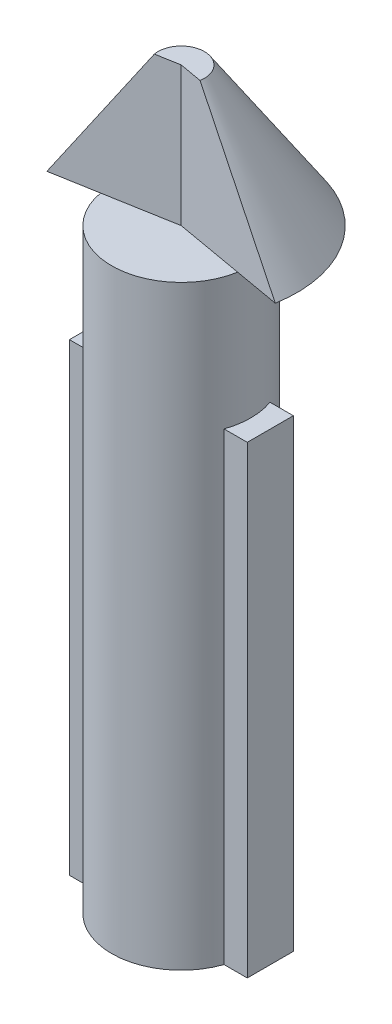
ISO-10303-21;
HEADER;
FILE_DESCRIPTION(('STEP AP214'),'2;1');
FILE_NAME('part.step','',(''),(''),'','','');
FILE_SCHEMA(('AUTOMOTIVE_DESIGN { 1 0 10303 214 1 1 1 1 }'));
ENDSEC;
DATA;
#1=APPLICATION_CONTEXT('core data for automotive mechanical design processes');
#2=APPLICATION_PROTOCOL_DEFINITION('international standard','automotive_design',2000,#1);
#3=PRODUCT_CONTEXT('',#1,'mechanical');
#4=PRODUCT('Part','Part','',(#3));
#5=PRODUCT_RELATED_PRODUCT_CATEGORY('part','',(#4));
#6=PRODUCT_DEFINITION_FORMATION('','',#4);
#7=PRODUCT_DEFINITION_CONTEXT('part definition',#1,'design');
#8=PRODUCT_DEFINITION('design','',#6,#7);
#9=PRODUCT_DEFINITION_SHAPE('','',#8);
#10=(LENGTH_UNIT() NAMED_UNIT(*) SI_UNIT(.MILLI.,.METRE.));
#11=(NAMED_UNIT(*) PLANE_ANGLE_UNIT() SI_UNIT($,.RADIAN.));
#12=(NAMED_UNIT(*) SI_UNIT($,.STERADIAN.) SOLID_ANGLE_UNIT());
#13=UNCERTAINTY_MEASURE_WITH_UNIT(LENGTH_MEASURE(1.E-05),#10,'distance_accuracy_value','');
#14=(GEOMETRIC_REPRESENTATION_CONTEXT(3) GLOBAL_UNCERTAINTY_ASSIGNED_CONTEXT((#13)) GLOBAL_UNIT_ASSIGNED_CONTEXT((#10,
#11,#12)) REPRESENTATION_CONTEXT('',''));
#15=CARTESIAN_POINT('',(0.,0.,0.));
#16=DIRECTION('',(0.,0.,1.));
#17=DIRECTION('',(1.,0.,0.));
#18=AXIS2_PLACEMENT_3D('',#15,#16,#17);
#19=CARTESIAN_POINT('',(0.,25.68,0.));
#20=DIRECTION('',(0.,-1.,0.));
#21=DIRECTION('',(0.,0.,-1.));
#22=AXIS2_PLACEMENT_3D('',#19,#20,#21);
#23=CYLINDRICAL_SURFACE('',#22,3.);
#24=CARTESIAN_POINT('',(0.,0.,0.));
#25=DIRECTION('',(0.,1.,0.));
#26=DIRECTION('',(0.,0.,1.));
#27=AXIS2_PLACEMENT_3D('',#24,#25,#26);
#28=CIRCLE('',#27,3.);
#29=CARTESIAN_POINT('',(-2.83333333333333,0.,0.986013297183269));
#30=VERTEX_POINT('',#29);
#31=CARTESIAN_POINT('',(2.83333333333333,0.,0.986013297183269));
#32=VERTEX_POINT('',#31);
#33=EDGE_CURVE('E42',#30,#32,#28,.T.);
#34=ORIENTED_EDGE('',*,*,#33,.T.);
#35=DIRECTION('',(0.,-1.,0.));
#36=VECTOR('',#35,1.);
#37=CARTESIAN_POINT('',(2.83333333333333,20.,0.986013297183269));
#38=LINE('',#37,#36);
#39=CARTESIAN_POINT('',(2.83333333333333,20.,0.986013297183269));
#40=VERTEX_POINT('',#39);
#41=EDGE_CURVE('E54',#40,#32,#38,.T.);
#42=ORIENTED_EDGE('',*,*,#41,.F.);
#43=CARTESIAN_POINT('',(0.,20.,0.));
#44=DIRECTION('',(0.,-1.,0.));
#45=DIRECTION('',(0.,0.,-1.));
#46=AXIS2_PLACEMENT_3D('',#43,#44,#45);
#47=CIRCLE('',#46,3.00000000000004);
#48=CARTESIAN_POINT('',(2.82842712474619,20.,-1.));
#49=VERTEX_POINT('',#48);
#50=EDGE_CURVE('E58',#40,#49,#47,.F.);
#51=ORIENTED_EDGE('',*,*,#50,.T.);
#52=DIRECTION('',(0.,-1.,0.));
#53=VECTOR('',#52,1.);
#54=CARTESIAN_POINT('',(2.82842712474619,20.,-1.));
#55=LINE('',#54,#53);
#56=CARTESIAN_POINT('',(2.82842712474619,0.,-1.));
#57=VERTEX_POINT('',#56);
#58=EDGE_CURVE('E138',#49,#57,#55,.T.);
#59=ORIENTED_EDGE('',*,*,#58,.T.);
#60=CARTESIAN_POINT('',(-2.82842712474619,0.,-1.));
#61=VERTEX_POINT('',#60);
#62=EDGE_CURVE('E215',#57,#61,#28,.T.);
#63=ORIENTED_EDGE('',*,*,#62,.T.);
#64=DIRECTION('',(0.,-1.,0.));
#65=VECTOR('',#64,1.);
#66=CARTESIAN_POINT('',(-2.82842712474619,20.,-1.));
#67=LINE('',#66,#65);
#68=CARTESIAN_POINT('',(-2.82842712474619,20.,-1.));
#69=VERTEX_POINT('',#68);
#70=EDGE_CURVE('E179',#69,#61,#67,.T.);
#71=ORIENTED_EDGE('',*,*,#70,.F.);
#72=CARTESIAN_POINT('',(0.,20.,0.));
#73=DIRECTION('',(0.,-1.,0.));
#74=DIRECTION('',(0.,0.,-1.));
#75=AXIS2_PLACEMENT_3D('',#72,#73,#74);
#76=CIRCLE('',#75,2.99999999999996);
#77=CARTESIAN_POINT('',(-2.83333333333333,20.,0.986013297183269));
#78=VERTEX_POINT('',#77);
#79=EDGE_CURVE('E162',#78,#69,#76,.T.);
#80=ORIENTED_EDGE('',*,*,#79,.F.);
#81=DIRECTION('',(0.,-1.,0.));
#82=VECTOR('',#81,1.);
#83=CARTESIAN_POINT('',(-2.83333333333333,20.,0.986013297183269));
#84=LINE('',#83,#82);
#85=EDGE_CURVE('E173',#78,#30,#84,.T.);
#86=ORIENTED_EDGE('',*,*,#85,.T.);
#87=EDGE_LOOP('',(#34,#42,#51,#59,#63,#71,#80,#86));
#88=FACE_BOUND('',#87,.T.);
#89=CARTESIAN_POINT('',(0.,25.68,0.));
#90=DIRECTION('',(0.,1.,0.));
#91=DIRECTION('',(0.,0.,1.));
#92=AXIS2_PLACEMENT_3D('',#89,#90,#91);
#93=CIRCLE('',#92,3.);
#94=CARTESIAN_POINT('',(2.95442325903662,25.68,0.520944533000802));
#95=VERTEX_POINT('',#94);
#96=CARTESIAN_POINT('',(-2.95442325903662,25.68,0.520944533000802));
#97=VERTEX_POINT('',#96);
#98=EDGE_CURVE('E11',#95,#97,#93,.T.);
#99=ORIENTED_EDGE('',*,*,#98,.F.);
#100=EDGE_CURVE('E47',#97,#95,#93,.T.);
#101=ORIENTED_EDGE('',*,*,#100,.F.);
#102=EDGE_LOOP('',(#99,#101));
#103=FACE_BOUND('',#102,.T.);
#104=ADVANCED_FACE('F39',(#88,#103),#23,.T.);
#105=CARTESIAN_POINT('',(0.,25.68,0.));
#106=DIRECTION('',(0.,1.,0.));
#107=DIRECTION('',(0.,0.,1.));
#108=AXIS2_PLACEMENT_3D('',#105,#106,#107);
#109=PLANE('',#108);
#110=DIRECTION('',(0.984807753012207,0.,0.173648177666934));
#111=VECTOR('',#110,1.);
#112=CARTESIAN_POINT('',(0.,25.68,0.));
#113=LINE('',#112,#111);
#114=CARTESIAN_POINT('',(0.,25.68,0.));
#115=VERTEX_POINT('',#114);
#116=EDGE_CURVE('E191',#115,#95,#113,.T.);
#117=ORIENTED_EDGE('',*,*,#116,.F.);
#118=DIRECTION('',(-0.984807753012208,0.,0.173648177666934));
#119=VECTOR('',#118,1.);
#120=CARTESIAN_POINT('',(0.,25.68,0.));
#121=LINE('',#120,#119);
#122=EDGE_CURVE('E203',#115,#97,#121,.T.);
#123=ORIENTED_EDGE('',*,*,#122,.T.);
#124=ORIENTED_EDGE('',*,*,#100,.T.);
#125=EDGE_LOOP('',(#117,#123,#124));
#126=FACE_BOUND('',#125,.T.);
#127=ADVANCED_FACE('F223',(#126),#109,.T.);
#128=CARTESIAN_POINT('',(0.,0.,0.));
#129=DIRECTION('',(0.,1.,0.));
#130=DIRECTION('',(0.,0.,1.));
#131=AXIS2_PLACEMENT_3D('',#128,#129,#130);
#132=PLANE('',#131);
#133=ORIENTED_EDGE('',*,*,#33,.F.);
#134=DIRECTION('',(1.,0.,0.));
#135=VECTOR('',#134,1.);
#136=CARTESIAN_POINT('',(0.,0.,0.986013297183269));
#137=LINE('',#136,#135);
#138=CARTESIAN_POINT('',(-3.83333333333333,0.,0.986013297183269));
#139=VERTEX_POINT('',#138);
#140=EDGE_CURVE('E159',#139,#30,#137,.T.);
#141=ORIENTED_EDGE('',*,*,#140,.F.);
#142=DIRECTION('',(0.,0.,1.));
#143=VECTOR('',#142,1.);
#144=CARTESIAN_POINT('',(-3.83333333333333,0.,0.));
#145=LINE('',#144,#143);
#146=CARTESIAN_POINT('',(-3.83333333333333,0.,-1.));
#147=VERTEX_POINT('',#146);
#148=EDGE_CURVE('E176',#147,#139,#145,.T.);
#149=ORIENTED_EDGE('',*,*,#148,.F.);
#150=DIRECTION('',(-1.,0.,0.));
#151=VECTOR('',#150,1.);
#152=CARTESIAN_POINT('',(0.,0.,-1.));
#153=LINE('',#152,#151);
#154=EDGE_CURVE('E166',#61,#147,#153,.T.);
#155=ORIENTED_EDGE('',*,*,#154,.F.);
#156=ORIENTED_EDGE('',*,*,#62,.F.);
#157=DIRECTION('',(1.,0.,0.));
#158=VECTOR('',#157,1.);
#159=CARTESIAN_POINT('',(0.,0.,-1.));
#160=LINE('',#159,#158);
#161=CARTESIAN_POINT('',(3.83333333333333,0.,-1.));
#162=VERTEX_POINT('',#161);
#163=EDGE_CURVE('E156',#57,#162,#160,.T.);
#164=ORIENTED_EDGE('',*,*,#163,.T.);
#165=DIRECTION('',(0.,0.,1.));
#166=VECTOR('',#165,1.);
#167=CARTESIAN_POINT('',(3.83333333333333,0.,0.));
#168=LINE('',#167,#166);
#169=CARTESIAN_POINT('',(3.83333333333333,0.,0.986013297183269));
#170=VERTEX_POINT('',#169);
#171=EDGE_CURVE('E133',#162,#170,#168,.T.);
#172=ORIENTED_EDGE('',*,*,#171,.T.);
#173=DIRECTION('',(-1.,0.,0.));
#174=VECTOR('',#173,1.);
#175=CARTESIAN_POINT('',(0.,0.,0.986013297183269));
#176=LINE('',#175,#174);
#177=EDGE_CURVE('E153',#170,#32,#176,.T.);
#178=ORIENTED_EDGE('',*,*,#177,.T.);
#179=EDGE_LOOP('',(#133,#141,#149,#155,#156,#164,#172,#178));
#180=FACE_BOUND('',#179,.T.);
#181=ADVANCED_FACE('F242',(#180),#132,.F.);
#182=CARTESIAN_POINT('',(0.,31.68,0.));
#183=DIRECTION('',(0.,1.,0.));
#184=DIRECTION('',(0.,0.,1.));
#185=AXIS2_PLACEMENT_3D('',#182,#183,#184);
#186=PLANE('',#185);
#187=CARTESIAN_POINT('',(0.,31.68,0.));
#188=DIRECTION('',(0.,-1.,0.));
#189=DIRECTION('',(0.,0.,-1.));
#190=AXIS2_PLACEMENT_3D('',#187,#188,#189);
#191=CIRCLE('',#190,1.);
#192=CARTESIAN_POINT('',(-0.984807753012208,31.68,0.173648177666934));
#193=VERTEX_POINT('',#192);
#194=CARTESIAN_POINT('',(0.984807753012208,31.68,0.173648177666934));
#195=VERTEX_POINT('',#194);
#196=EDGE_CURVE('E214',#193,#195,#191,.T.);
#197=ORIENTED_EDGE('',*,*,#196,.F.);
#198=DIRECTION('',(0.984807753012208,0.,-0.173648177666934));
#199=VECTOR('',#198,1.);
#200=CARTESIAN_POINT('',(0.,31.68,0.));
#201=LINE('',#200,#199);
#202=CARTESIAN_POINT('',(0.,31.68,0.));
#203=VERTEX_POINT('',#202);
#204=EDGE_CURVE('E208',#193,#203,#201,.T.);
#205=ORIENTED_EDGE('',*,*,#204,.T.);
#206=DIRECTION('',(-0.984807753012207,0.,-0.173648177666934));
#207=VECTOR('',#206,1.);
#208=CARTESIAN_POINT('',(0.,31.68,0.));
#209=LINE('',#208,#207);
#210=EDGE_CURVE('E197',#195,#203,#209,.T.);
#211=ORIENTED_EDGE('',*,*,#210,.F.);
#212=EDGE_LOOP('',(#197,#205,#211));
#213=FACE_BOUND('',#212,.T.);
#214=ADVANCED_FACE('F240',(#213),#186,.T.);
#215=CARTESIAN_POINT('',(0.,25.68,0.));
#216=DIRECTION('',(0.,-1.,0.));
#217=DIRECTION('',(0.,0.,-1.));
#218=AXIS2_PLACEMENT_3D('',#215,#216,#217);
#219=CONICAL_SURFACE('',#218,5.,0.588002603547568);
#220=CARTESIAN_POINT('',(0.,25.68,0.));
#221=DIRECTION('',(0.,-1.,0.));
#222=DIRECTION('',(0.,0.,-1.));
#223=AXIS2_PLACEMENT_3D('',#220,#221,#222);
#224=CIRCLE('',#223,5.);
#225=CARTESIAN_POINT('',(-4.92403876506104,25.68,0.86824088833467));
#226=VERTEX_POINT('',#225);
#227=CARTESIAN_POINT('',(4.92403876506104,25.68,0.86824088833467));
#228=VERTEX_POINT('',#227);
#229=EDGE_CURVE('E211',#226,#228,#224,.T.);
#230=ORIENTED_EDGE('',*,*,#229,.F.);
#231=DIRECTION('',(0.546273053839999,0.832050294337843,-0.0963226782260018));
#232=VECTOR('',#231,1.);
#233=CARTESIAN_POINT('',(-0.984807753012208,31.68,0.173648177666934));
#234=LINE('',#233,#232);
#235=EDGE_CURVE('E205',#226,#193,#234,.T.);
#236=ORIENTED_EDGE('',*,*,#235,.T.);
#237=ORIENTED_EDGE('',*,*,#196,.T.);
#238=DIRECTION('',(-0.546273053839999,0.832050294337844,-0.0963226782260018));
#239=VECTOR('',#238,1.);
#240=CARTESIAN_POINT('',(0.984807753012208,31.68,0.173648177666934));
#241=LINE('',#240,#239);
#242=EDGE_CURVE('E194',#228,#195,#241,.T.);
#243=ORIENTED_EDGE('',*,*,#242,.F.);
#244=EDGE_LOOP('',(#230,#236,#237,#243));
#245=FACE_BOUND('',#244,.T.);
#246=ADVANCED_FACE('F238',(#245),#219,.T.);
#247=CARTESIAN_POINT('',(0.,25.68,0.));
#248=DIRECTION('',(0.,-1.,0.));
#249=DIRECTION('',(0.,0.,-1.));
#250=AXIS2_PLACEMENT_3D('',#247,#248,#249);
#251=PLANE('',#250);
#252=EDGE_CURVE('E182',#95,#228,#113,.T.);
#253=ORIENTED_EDGE('',*,*,#252,.F.);
#254=ORIENTED_EDGE('',*,*,#98,.T.);
#255=EDGE_CURVE('E202',#97,#226,#121,.T.);
#256=ORIENTED_EDGE('',*,*,#255,.T.);
#257=ORIENTED_EDGE('',*,*,#229,.T.);
#258=EDGE_LOOP('',(#253,#254,#256,#257));
#259=FACE_BOUND('',#258,.T.);
#260=ADVANCED_FACE('F227',(#259),#251,.T.);
#261=CARTESIAN_POINT('',(0.,0.,0.));
#262=DIRECTION('',(0.173648177666934,0.,0.984807753012208));
#263=DIRECTION('',(0.984807753012208,0.,-0.173648177666934));
#264=AXIS2_PLACEMENT_3D('',#261,#262,#263);
#265=PLANE('',#264);
#266=DIRECTION('',(0.,-1.,0.));
#267=VECTOR('',#266,1.);
#268=CARTESIAN_POINT('',(0.,25.68,0.));
#269=LINE('',#268,#267);
#270=EDGE_CURVE('E199',#203,#115,#269,.T.);
#271=ORIENTED_EDGE('',*,*,#270,.F.);
#272=ORIENTED_EDGE('',*,*,#204,.F.);
#273=ORIENTED_EDGE('',*,*,#235,.F.);
#274=ORIENTED_EDGE('',*,*,#255,.F.);
#275=ORIENTED_EDGE('',*,*,#122,.F.);
#276=EDGE_LOOP('',(#271,#272,#273,#274,#275));
#277=FACE_BOUND('',#276,.T.);
#278=ADVANCED_FACE('F236',(#277),#265,.T.);
#279=CARTESIAN_POINT('',(0.,0.,0.));
#280=DIRECTION('',(0.173648177666934,0.,-0.984807753012207));
#281=DIRECTION('',(-0.984807753012207,0.,-0.173648177666934));
#282=AXIS2_PLACEMENT_3D('',#279,#280,#281);
#283=PLANE('',#282);
#284=ORIENTED_EDGE('',*,*,#270,.T.);
#285=ORIENTED_EDGE('',*,*,#116,.T.);
#286=ORIENTED_EDGE('',*,*,#252,.T.);
#287=ORIENTED_EDGE('',*,*,#242,.T.);
#288=ORIENTED_EDGE('',*,*,#210,.T.);
#289=EDGE_LOOP('',(#284,#285,#286,#287,#288));
#290=FACE_BOUND('',#289,.T.);
#291=ADVANCED_FACE('F231',(#290),#283,.F.);
#292=CARTESIAN_POINT('',(0.,20.,-1.));
#293=DIRECTION('',(0.,0.,1.));
#294=DIRECTION('',(1.,0.,0.));
#295=AXIS2_PLACEMENT_3D('',#292,#293,#294);
#296=PLANE('',#295);
#297=ORIENTED_EDGE('',*,*,#154,.T.);
#298=DIRECTION('',(0.,-1.,0.));
#299=VECTOR('',#298,1.);
#300=CARTESIAN_POINT('',(-3.83333333333333,20.,-1.));
#301=LINE('',#300,#299);
#302=CARTESIAN_POINT('',(-3.83333333333333,20.,-1.));
#303=VERTEX_POINT('',#302);
#304=EDGE_CURVE('E183',#303,#147,#301,.T.);
#305=ORIENTED_EDGE('',*,*,#304,.F.);
#306=DIRECTION('',(-1.,0.,0.));
#307=VECTOR('',#306,1.);
#308=CARTESIAN_POINT('',(0.,20.,-1.));
#309=LINE('',#308,#307);
#310=EDGE_CURVE('E171',#69,#303,#309,.T.);
#311=ORIENTED_EDGE('',*,*,#310,.F.);
#312=ORIENTED_EDGE('',*,*,#70,.T.);
#313=EDGE_LOOP('',(#297,#305,#311,#312));
#314=FACE_BOUND('',#313,.T.);
#315=ADVANCED_FACE('F271',(#314),#296,.F.);
#316=CARTESIAN_POINT('',(-3.83333333333333,20.,0.));
#317=DIRECTION('',(1.,0.,0.));
#318=DIRECTION('',(0.,0.,-1.));
#319=AXIS2_PLACEMENT_3D('',#316,#317,#318);
#320=PLANE('',#319);
#321=ORIENTED_EDGE('',*,*,#148,.T.);
#322=DIRECTION('',(0.,-1.,0.));
#323=VECTOR('',#322,1.);
#324=CARTESIAN_POINT('',(-3.83333333333333,20.,0.986013297183269));
#325=LINE('',#324,#323);
#326=CARTESIAN_POINT('',(-3.83333333333333,20.,0.986013297183269));
#327=VERTEX_POINT('',#326);
#328=EDGE_CURVE('E186',#327,#139,#325,.T.);
#329=ORIENTED_EDGE('',*,*,#328,.F.);
#330=DIRECTION('',(0.,0.,1.));
#331=VECTOR('',#330,1.);
#332=CARTESIAN_POINT('',(-3.83333333333333,20.,0.));
#333=LINE('',#332,#331);
#334=EDGE_CURVE('E169',#303,#327,#333,.T.);
#335=ORIENTED_EDGE('',*,*,#334,.F.);
#336=ORIENTED_EDGE('',*,*,#304,.T.);
#337=EDGE_LOOP('',(#321,#329,#335,#336));
#338=FACE_BOUND('',#337,.T.);
#339=ADVANCED_FACE('F275',(#338),#320,.F.);
#340=CARTESIAN_POINT('',(0.,20.,0.986013297183269));
#341=DIRECTION('',(0.,0.,-1.));
#342=DIRECTION('',(-1.,0.,0.));
#343=AXIS2_PLACEMENT_3D('',#340,#341,#342);
#344=PLANE('',#343);
#345=ORIENTED_EDGE('',*,*,#140,.T.);
#346=ORIENTED_EDGE('',*,*,#85,.F.);
#347=DIRECTION('',(1.,0.,0.));
#348=VECTOR('',#347,1.);
#349=CARTESIAN_POINT('',(0.,20.,0.986013297183269));
#350=LINE('',#349,#348);
#351=EDGE_CURVE('E165',#327,#78,#350,.T.);
#352=ORIENTED_EDGE('',*,*,#351,.F.);
#353=ORIENTED_EDGE('',*,*,#328,.T.);
#354=EDGE_LOOP('',(#345,#346,#352,#353));
#355=FACE_BOUND('',#354,.T.);
#356=ADVANCED_FACE('F287',(#355),#344,.F.);
#357=CARTESIAN_POINT('',(0.,20.,0.));
#358=DIRECTION('',(0.,-1.,0.));
#359=DIRECTION('',(0.,0.,-1.));
#360=AXIS2_PLACEMENT_3D('',#357,#358,#359);
#361=PLANE('',#360);
#362=ORIENTED_EDGE('',*,*,#79,.T.);
#363=ORIENTED_EDGE('',*,*,#310,.T.);
#364=ORIENTED_EDGE('',*,*,#334,.T.);
#365=ORIENTED_EDGE('',*,*,#351,.T.);
#366=EDGE_LOOP('',(#362,#363,#364,#365));
#367=FACE_BOUND('',#366,.T.);
#368=ADVANCED_FACE('F298',(#367),#361,.F.);
#369=CARTESIAN_POINT('',(0.,20.,0.986013297183269));
#370=DIRECTION('',(0.,0.,1.));
#371=DIRECTION('',(1.,0.,0.));
#372=AXIS2_PLACEMENT_3D('',#369,#370,#371);
#373=PLANE('',#372);
#374=ORIENTED_EDGE('',*,*,#177,.F.);
#375=DIRECTION('',(0.,-1.,0.));
#376=VECTOR('',#375,1.);
#377=CARTESIAN_POINT('',(3.83333333333333,20.,0.986013297183269));
#378=LINE('',#377,#376);
#379=CARTESIAN_POINT('',(3.83333333333333,20.,0.986013297183269));
#380=VERTEX_POINT('',#379);
#381=EDGE_CURVE('E137',#380,#170,#378,.T.);
#382=ORIENTED_EDGE('',*,*,#381,.F.);
#383=DIRECTION('',(-1.,0.,0.));
#384=VECTOR('',#383,1.);
#385=CARTESIAN_POINT('',(0.,20.,0.986013297183269));
#386=LINE('',#385,#384);
#387=EDGE_CURVE('E148',#380,#40,#386,.T.);
#388=ORIENTED_EDGE('',*,*,#387,.T.);
#389=ORIENTED_EDGE('',*,*,#41,.T.);
#390=EDGE_LOOP('',(#374,#382,#388,#389));
#391=FACE_BOUND('',#390,.T.);
#392=ADVANCED_FACE('F309',(#391),#373,.T.);
#393=CARTESIAN_POINT('',(3.83333333333333,20.,0.));
#394=DIRECTION('',(1.,0.,0.));
#395=DIRECTION('',(0.,0.,-1.));
#396=AXIS2_PLACEMENT_3D('',#393,#394,#395);
#397=PLANE('',#396);
#398=ORIENTED_EDGE('',*,*,#171,.F.);
#399=DIRECTION('',(0.,-1.,0.));
#400=VECTOR('',#399,1.);
#401=CARTESIAN_POINT('',(3.83333333333333,20.,-1.));
#402=LINE('',#401,#400);
#403=CARTESIAN_POINT('',(3.83333333333333,20.,-1.));
#404=VERTEX_POINT('',#403);
#405=EDGE_CURVE('E127',#404,#162,#402,.T.);
#406=ORIENTED_EDGE('',*,*,#405,.F.);
#407=DIRECTION('',(0.,0.,1.));
#408=VECTOR('',#407,1.);
#409=CARTESIAN_POINT('',(3.83333333333333,20.,0.));
#410=LINE('',#409,#408);
#411=EDGE_CURVE('E131',#404,#380,#410,.T.);
#412=ORIENTED_EDGE('',*,*,#411,.T.);
#413=ORIENTED_EDGE('',*,*,#381,.T.);
#414=EDGE_LOOP('',(#398,#406,#412,#413));
#415=FACE_BOUND('',#414,.T.);
#416=ADVANCED_FACE('F129',(#415),#397,.T.);
#417=CARTESIAN_POINT('',(0.,20.,-1.));
#418=DIRECTION('',(0.,0.,-1.));
#419=DIRECTION('',(-1.,0.,0.));
#420=AXIS2_PLACEMENT_3D('',#417,#418,#419);
#421=PLANE('',#420);
#422=ORIENTED_EDGE('',*,*,#163,.F.);
#423=ORIENTED_EDGE('',*,*,#58,.F.);
#424=DIRECTION('',(1.,0.,0.));
#425=VECTOR('',#424,1.);
#426=CARTESIAN_POINT('',(0.,20.,-1.));
#427=LINE('',#426,#425);
#428=EDGE_CURVE('E141',#49,#404,#427,.T.);
#429=ORIENTED_EDGE('',*,*,#428,.T.);
#430=ORIENTED_EDGE('',*,*,#405,.T.);
#431=EDGE_LOOP('',(#422,#423,#429,#430));
#432=FACE_BOUND('',#431,.T.);
#433=ADVANCED_FACE('F142',(#432),#421,.T.);
#434=CARTESIAN_POINT('',(0.,20.,0.));
#435=DIRECTION('',(0.,-1.,0.));
#436=DIRECTION('',(0.,0.,-1.));
#437=AXIS2_PLACEMENT_3D('',#434,#435,#436);
#438=PLANE('',#437);
#439=ORIENTED_EDGE('',*,*,#387,.F.);
#440=ORIENTED_EDGE('',*,*,#411,.F.);
#441=ORIENTED_EDGE('',*,*,#428,.F.);
#442=ORIENTED_EDGE('',*,*,#50,.F.);
#443=EDGE_LOOP('',(#439,#440,#441,#442));
#444=FACE_BOUND('',#443,.T.);
#445=ADVANCED_FACE('F146',(#444),#438,.F.);
#446=CLOSED_SHELL('',(#104,#127,#181,#214,#246,#260,#278,#291,#315,#339,#356,#368,#392,#416,
#433,#445));
#447=MANIFOLD_SOLID_BREP('B2',#446);
#448=ADVANCED_BREP_SHAPE_REPRESENTATION('',(#18,#447),#14);
#449=SHAPE_DEFINITION_REPRESENTATION(#9,#448);
ENDSEC;
END-ISO-10303-21;
